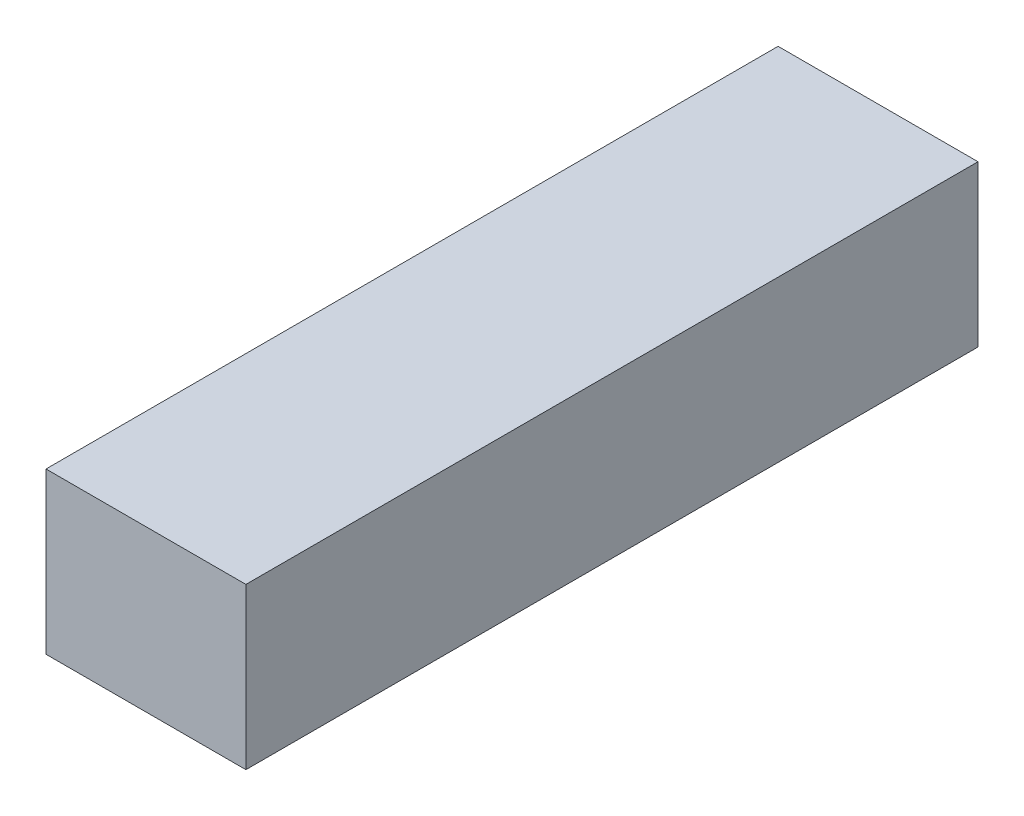
ISO-10303-21;
HEADER;
FILE_DESCRIPTION(('STEP AP214'),'2;1');
FILE_NAME('part.step','',(''),(''),'','','');
FILE_SCHEMA(('AUTOMOTIVE_DESIGN { 1 0 10303 214 1 1 1 1 }'));
ENDSEC;
DATA;
#1=APPLICATION_CONTEXT('core data for automotive mechanical design processes');
#2=APPLICATION_PROTOCOL_DEFINITION('international standard','automotive_design',2000,#1);
#3=PRODUCT_CONTEXT('',#1,'mechanical');
#4=PRODUCT('Part','Part','',(#3));
#5=PRODUCT_RELATED_PRODUCT_CATEGORY('part','',(#4));
#6=PRODUCT_DEFINITION_FORMATION('','',#4);
#7=PRODUCT_DEFINITION_CONTEXT('part definition',#1,'design');
#8=PRODUCT_DEFINITION('design','',#6,#7);
#9=PRODUCT_DEFINITION_SHAPE('','',#8);
#10=(LENGTH_UNIT() NAMED_UNIT(*) SI_UNIT(.MILLI.,.METRE.));
#11=(NAMED_UNIT(*) PLANE_ANGLE_UNIT() SI_UNIT($,.RADIAN.));
#12=(NAMED_UNIT(*) SI_UNIT($,.STERADIAN.) SOLID_ANGLE_UNIT());
#13=UNCERTAINTY_MEASURE_WITH_UNIT(LENGTH_MEASURE(1.E-05),#10,'distance_accuracy_value','');
#14=(GEOMETRIC_REPRESENTATION_CONTEXT(3) GLOBAL_UNCERTAINTY_ASSIGNED_CONTEXT((#13)) GLOBAL_UNIT_ASSIGNED_CONTEXT((#10,
#11,#12)) REPRESENTATION_CONTEXT('',''));
#15=CARTESIAN_POINT('',(0.,0.,0.));
#16=DIRECTION('',(0.,0.,1.));
#17=DIRECTION('',(1.,0.,0.));
#18=AXIS2_PLACEMENT_3D('',#15,#16,#17);
#19=CARTESIAN_POINT('',(6.22863678895719,10.,22.8102779703703));
#20=DIRECTION('',(-1.,0.,0.));
#21=DIRECTION('',(0.,0.,1.));
#22=AXIS2_PLACEMENT_3D('',#19,#20,#21);
#23=PLANE('',#22);
#24=DIRECTION('',(0.,0.,-1.));
#25=VECTOR('',#24,1.);
#26=CARTESIAN_POINT('',(6.22863678895719,0.,22.8102779703703));
#27=LINE('',#26,#25);
#28=CARTESIAN_POINT('',(6.22863678895719,0.,22.8102779703703));
#29=VERTEX_POINT('',#28);
#30=CARTESIAN_POINT('',(6.22863678895719,0.,-22.8102779703703));
#31=VERTEX_POINT('',#30);
#32=EDGE_CURVE('E96',#29,#31,#27,.T.);
#33=ORIENTED_EDGE('',*,*,#32,.T.);
#34=DIRECTION('',(0.,-1.,0.));
#35=VECTOR('',#34,1.);
#36=CARTESIAN_POINT('',(6.22863678895719,10.,-22.8102779703703));
#37=LINE('',#36,#35);
#38=CARTESIAN_POINT('',(6.22863678895719,10.,-22.8102779703703));
#39=VERTEX_POINT('',#38);
#40=EDGE_CURVE('E11',#39,#31,#37,.T.);
#41=ORIENTED_EDGE('',*,*,#40,.F.);
#42=DIRECTION('',(0.,0.,-1.));
#43=VECTOR('',#42,1.);
#44=CARTESIAN_POINT('',(6.22863678895719,10.,22.8102779703703));
#45=LINE('',#44,#43);
#46=CARTESIAN_POINT('',(6.22863678895719,10.,22.8102779703703));
#47=VERTEX_POINT('',#46);
#48=EDGE_CURVE('E84',#47,#39,#45,.T.);
#49=ORIENTED_EDGE('',*,*,#48,.F.);
#50=DIRECTION('',(0.,-1.,0.));
#51=VECTOR('',#50,1.);
#52=CARTESIAN_POINT('',(6.22863678895719,10.,22.8102779703703));
#53=LINE('',#52,#51);
#54=EDGE_CURVE('E92',#47,#29,#53,.T.);
#55=ORIENTED_EDGE('',*,*,#54,.T.);
#56=EDGE_LOOP('',(#33,#41,#49,#55));
#57=FACE_BOUND('',#56,.T.);
#58=ADVANCED_FACE('F33',(#57),#23,.F.);
#59=CARTESIAN_POINT('',(-6.22863678895719,10.,-22.8102779703703));
#60=DIRECTION('',(0.,0.,1.));
#61=DIRECTION('',(1.,0.,0.));
#62=AXIS2_PLACEMENT_3D('',#59,#60,#61);
#63=PLANE('',#62);
#64=DIRECTION('',(-1.,0.,0.));
#65=VECTOR('',#64,1.);
#66=CARTESIAN_POINT('',(-6.22863678895719,0.,-22.8102779703703));
#67=LINE('',#66,#65);
#68=CARTESIAN_POINT('',(-6.22863678895719,0.,-22.8102779703703));
#69=VERTEX_POINT('',#68);
#70=EDGE_CURVE('E88',#31,#69,#67,.T.);
#71=ORIENTED_EDGE('',*,*,#70,.T.);
#72=DIRECTION('',(0.,-1.,0.));
#73=VECTOR('',#72,1.);
#74=CARTESIAN_POINT('',(-6.22863678895719,10.,-22.8102779703703));
#75=LINE('',#74,#73);
#76=CARTESIAN_POINT('',(-6.22863678895719,10.,-22.8102779703703));
#77=VERTEX_POINT('',#76);
#78=EDGE_CURVE('E41',#77,#69,#75,.T.);
#79=ORIENTED_EDGE('',*,*,#78,.F.);
#80=DIRECTION('',(-1.,0.,0.));
#81=VECTOR('',#80,1.);
#82=CARTESIAN_POINT('',(-6.22863678895719,10.,-22.8102779703703));
#83=LINE('',#82,#81);
#84=EDGE_CURVE('E79',#39,#77,#83,.T.);
#85=ORIENTED_EDGE('',*,*,#84,.F.);
#86=ORIENTED_EDGE('',*,*,#40,.T.);
#87=EDGE_LOOP('',(#71,#79,#85,#86));
#88=FACE_BOUND('',#87,.T.);
#89=ADVANCED_FACE('F87',(#88),#63,.F.);
#90=CARTESIAN_POINT('',(-6.22863678895719,10.,22.8102779703703));
#91=DIRECTION('',(1.,0.,0.));
#92=DIRECTION('',(0.,0.,-1.));
#93=AXIS2_PLACEMENT_3D('',#90,#91,#92);
#94=PLANE('',#93);
#95=DIRECTION('',(0.,0.,1.));
#96=VECTOR('',#95,1.);
#97=CARTESIAN_POINT('',(-6.22863678895719,0.,22.8102779703703));
#98=LINE('',#97,#96);
#99=CARTESIAN_POINT('',(-6.22863678895719,0.,22.8102779703703));
#100=VERTEX_POINT('',#99);
#101=EDGE_CURVE('E66',#69,#100,#98,.T.);
#102=ORIENTED_EDGE('',*,*,#101,.T.);
#103=DIRECTION('',(0.,-1.,0.));
#104=VECTOR('',#103,1.);
#105=CARTESIAN_POINT('',(-6.22863678895719,10.,22.8102779703703));
#106=LINE('',#105,#104);
#107=CARTESIAN_POINT('',(-6.22863678895719,10.,22.8102779703703));
#108=VERTEX_POINT('',#107);
#109=EDGE_CURVE('E89',#108,#100,#106,.T.);
#110=ORIENTED_EDGE('',*,*,#109,.F.);
#111=DIRECTION('',(0.,0.,1.));
#112=VECTOR('',#111,1.);
#113=CARTESIAN_POINT('',(-6.22863678895719,10.,22.8102779703703));
#114=LINE('',#113,#112);
#115=EDGE_CURVE('E82',#77,#108,#114,.T.);
#116=ORIENTED_EDGE('',*,*,#115,.F.);
#117=ORIENTED_EDGE('',*,*,#78,.T.);
#118=EDGE_LOOP('',(#102,#110,#116,#117));
#119=FACE_BOUND('',#118,.T.);
#120=ADVANCED_FACE('F90',(#119),#94,.F.);
#121=CARTESIAN_POINT('',(-6.22863678895719,10.,22.8102779703703));
#122=DIRECTION('',(0.,0.,-1.));
#123=DIRECTION('',(-1.,0.,0.));
#124=AXIS2_PLACEMENT_3D('',#121,#122,#123);
#125=PLANE('',#124);
#126=DIRECTION('',(1.,0.,0.));
#127=VECTOR('',#126,1.);
#128=CARTESIAN_POINT('',(-6.22863678895719,0.,22.8102779703703));
#129=LINE('',#128,#127);
#130=EDGE_CURVE('E72',#100,#29,#129,.T.);
#131=ORIENTED_EDGE('',*,*,#130,.T.);
#132=ORIENTED_EDGE('',*,*,#54,.F.);
#133=DIRECTION('',(1.,0.,0.));
#134=VECTOR('',#133,1.);
#135=CARTESIAN_POINT('',(-6.22863678895719,10.,22.8102779703703));
#136=LINE('',#135,#134);
#137=EDGE_CURVE('E49',#108,#47,#136,.T.);
#138=ORIENTED_EDGE('',*,*,#137,.F.);
#139=ORIENTED_EDGE('',*,*,#109,.T.);
#140=EDGE_LOOP('',(#131,#132,#138,#139));
#141=FACE_BOUND('',#140,.T.);
#142=ADVANCED_FACE('F103',(#141),#125,.F.);
#143=CARTESIAN_POINT('',(0.,10.,0.));
#144=DIRECTION('',(0.,-1.,0.));
#145=DIRECTION('',(0.,0.,-1.));
#146=AXIS2_PLACEMENT_3D('',#143,#144,#145);
#147=PLANE('',#146);
#148=ORIENTED_EDGE('',*,*,#48,.T.);
#149=ORIENTED_EDGE('',*,*,#84,.T.);
#150=ORIENTED_EDGE('',*,*,#115,.T.);
#151=ORIENTED_EDGE('',*,*,#137,.T.);
#152=EDGE_LOOP('',(#148,#149,#150,#151));
#153=FACE_BOUND('',#152,.T.);
#154=ADVANCED_FACE('F80',(#153),#147,.F.);
#155=CARTESIAN_POINT('',(0.,0.,0.));
#156=DIRECTION('',(0.,-1.,0.));
#157=DIRECTION('',(0.,0.,-1.));
#158=AXIS2_PLACEMENT_3D('',#155,#156,#157);
#159=PLANE('',#158);
#160=ORIENTED_EDGE('',*,*,#32,.F.);
#161=ORIENTED_EDGE('',*,*,#130,.F.);
#162=ORIENTED_EDGE('',*,*,#101,.F.);
#163=ORIENTED_EDGE('',*,*,#70,.F.);
#164=EDGE_LOOP('',(#160,#161,#162,#163));
#165=FACE_BOUND('',#164,.T.);
#166=ADVANCED_FACE('F106',(#165),#159,.T.);
#167=CLOSED_SHELL('',(#58,#89,#120,#142,#154,#166));
#168=MANIFOLD_SOLID_BREP('B2',#167);
#169=ADVANCED_BREP_SHAPE_REPRESENTATION('',(#18,#168),#14);
#170=SHAPE_DEFINITION_REPRESENTATION(#9,#169);
ENDSEC;
END-ISO-10303-21;
